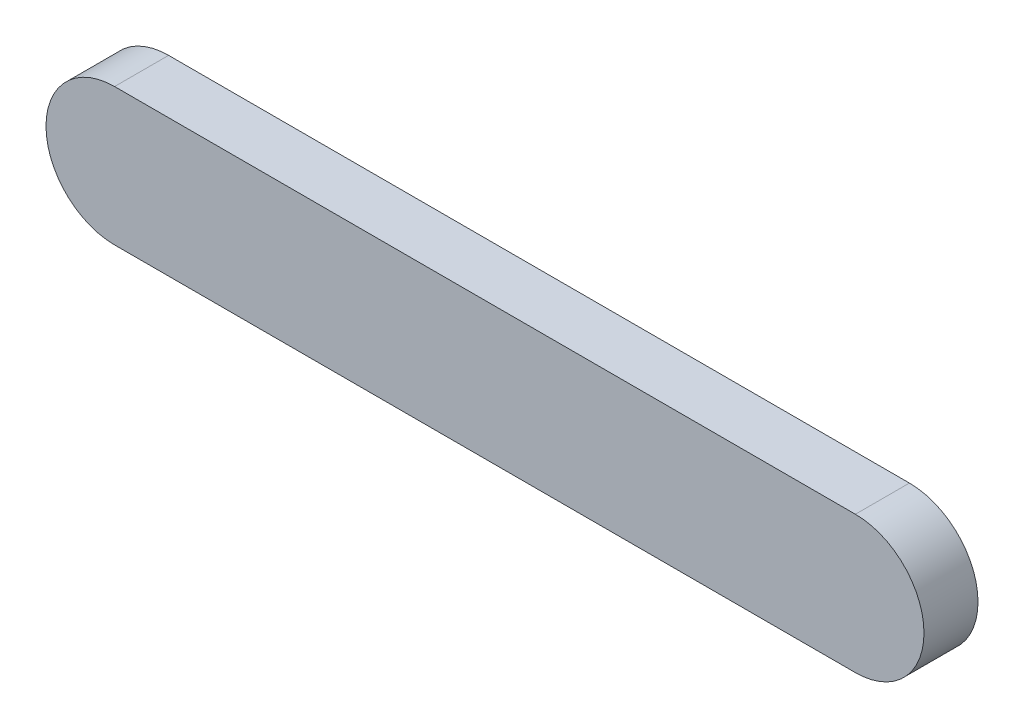
ISO-10303-21;
HEADER;
FILE_DESCRIPTION(('STEP AP214'),'2;1');
FILE_NAME('part.step','',(''),(''),'','','');
FILE_SCHEMA(('AUTOMOTIVE_DESIGN { 1 0 10303 214 1 1 1 1 }'));
ENDSEC;
DATA;
#1=APPLICATION_CONTEXT('core data for automotive mechanical design processes');
#2=APPLICATION_PROTOCOL_DEFINITION('international standard','automotive_design',2000,#1);
#3=PRODUCT_CONTEXT('',#1,'mechanical');
#4=PRODUCT('Part','Part','',(#3));
#5=PRODUCT_RELATED_PRODUCT_CATEGORY('part','',(#4));
#6=PRODUCT_DEFINITION_FORMATION('','',#4);
#7=PRODUCT_DEFINITION_CONTEXT('part definition',#1,'design');
#8=PRODUCT_DEFINITION('design','',#6,#7);
#9=PRODUCT_DEFINITION_SHAPE('','',#8);
#10=(LENGTH_UNIT() NAMED_UNIT(*) SI_UNIT(.MILLI.,.METRE.));
#11=(NAMED_UNIT(*) PLANE_ANGLE_UNIT() SI_UNIT($,.RADIAN.));
#12=(NAMED_UNIT(*) SI_UNIT($,.STERADIAN.) SOLID_ANGLE_UNIT());
#13=UNCERTAINTY_MEASURE_WITH_UNIT(LENGTH_MEASURE(1.E-05),#10,'distance_accuracy_value','');
#14=(GEOMETRIC_REPRESENTATION_CONTEXT(3) GLOBAL_UNCERTAINTY_ASSIGNED_CONTEXT((#13)) GLOBAL_UNIT_ASSIGNED_CONTEXT((#10,
#11,#12)) REPRESENTATION_CONTEXT('',''));
#15=CARTESIAN_POINT('',(0.,0.,0.));
#16=DIRECTION('',(0.,0.,1.));
#17=DIRECTION('',(1.,0.,0.));
#18=AXIS2_PLACEMENT_3D('',#15,#16,#17);
#19=CARTESIAN_POINT('',(112.776,117.9576,0.));
#20=DIRECTION('',(0.,1.,0.));
#21=DIRECTION('',(1.,0.,0.));
#22=AXIS2_PLACEMENT_3D('',#19,#20,#21);
#23=PLANE('',#22);
#24=DIRECTION('',(1.,0.,0.));
#25=VECTOR('',#24,1.);
#26=CARTESIAN_POINT('',(112.776,117.9576,0.1999996));
#27=LINE('',#26,#25);
#28=CARTESIAN_POINT('',(112.776,117.9576,0.1999996));
#29=VERTEX_POINT('',#28);
#30=CARTESIAN_POINT('',(115.5192,117.9576,0.1999996));
#31=VERTEX_POINT('',#30);
#32=EDGE_CURVE('E11',#29,#31,#27,.T.);
#33=ORIENTED_EDGE('',*,*,#32,.F.);
#34=DIRECTION('',(0.,0.,1.));
#35=VECTOR('',#34,1.);
#36=CARTESIAN_POINT('',(112.776,117.9576,0.));
#37=LINE('',#36,#35);
#38=CARTESIAN_POINT('',(112.776,117.9576,0.));
#39=VERTEX_POINT('',#38);
#40=EDGE_CURVE('E24',#39,#29,#37,.T.);
#41=ORIENTED_EDGE('',*,*,#40,.F.);
#42=DIRECTION('',(1.,0.,0.));
#43=VECTOR('',#42,1.);
#44=CARTESIAN_POINT('',(112.776,117.9576,0.));
#45=LINE('',#44,#43);
#46=CARTESIAN_POINT('',(115.5192,117.9576,0.));
#47=VERTEX_POINT('',#46);
#48=EDGE_CURVE('E75',#39,#47,#45,.T.);
#49=ORIENTED_EDGE('',*,*,#48,.T.);
#50=DIRECTION('',(0.,0.,1.));
#51=VECTOR('',#50,1.);
#52=CARTESIAN_POINT('',(115.5192,117.9576,0.));
#53=LINE('',#52,#51);
#54=EDGE_CURVE('E37',#47,#31,#53,.T.);
#55=ORIENTED_EDGE('',*,*,#54,.T.);
#56=EDGE_LOOP('',(#33,#41,#49,#55));
#57=FACE_BOUND('',#56,.T.);
#58=ADVANCED_FACE('F17',(#57),#23,.F.);
#59=CARTESIAN_POINT('',(115.5192,118.2116,0.));
#60=DIRECTION('',(0.,0.,-1.));
#61=DIRECTION('',(0.,-1.,0.));
#62=AXIS2_PLACEMENT_3D('',#59,#60,#61);
#63=CYLINDRICAL_SURFACE('',#62,0.254);
#64=CARTESIAN_POINT('',(115.5192,118.2116,0.1999996));
#65=DIRECTION('',(0.,0.,1.));
#66=DIRECTION('',(0.,-1.,0.));
#67=AXIS2_PLACEMENT_3D('',#64,#65,#66);
#68=CIRCLE('',#67,0.254);
#69=CARTESIAN_POINT('',(115.5192,118.4656,0.1999996));
#70=VERTEX_POINT('',#69);
#71=EDGE_CURVE('E83',#31,#70,#68,.T.);
#72=ORIENTED_EDGE('',*,*,#71,.F.);
#73=ORIENTED_EDGE('',*,*,#54,.F.);
#74=CARTESIAN_POINT('',(115.5192,118.2116,0.));
#75=DIRECTION('',(0.,0.,1.));
#76=DIRECTION('',(0.,-1.,0.));
#77=AXIS2_PLACEMENT_3D('',#74,#75,#76);
#78=CIRCLE('',#77,0.254);
#79=CARTESIAN_POINT('',(115.5192,118.4656,0.));
#80=VERTEX_POINT('',#79);
#81=EDGE_CURVE('E81',#47,#80,#78,.T.);
#82=ORIENTED_EDGE('',*,*,#81,.T.);
#83=DIRECTION('',(0.,0.,1.));
#84=VECTOR('',#83,1.);
#85=CARTESIAN_POINT('',(115.5192,118.4656,0.));
#86=LINE('',#85,#84);
#87=EDGE_CURVE('E67',#80,#70,#86,.T.);
#88=ORIENTED_EDGE('',*,*,#87,.T.);
#89=EDGE_LOOP('',(#72,#73,#82,#88));
#90=FACE_BOUND('',#89,.T.);
#91=ADVANCED_FACE('F89',(#90),#63,.T.);
#92=CARTESIAN_POINT('',(115.5192,118.4656,0.));
#93=DIRECTION('',(0.,-1.,0.));
#94=DIRECTION('',(-1.,0.,0.));
#95=AXIS2_PLACEMENT_3D('',#92,#93,#94);
#96=PLANE('',#95);
#97=DIRECTION('',(-1.,0.,0.));
#98=VECTOR('',#97,1.);
#99=CARTESIAN_POINT('',(115.5192,118.4656,0.1999996));
#100=LINE('',#99,#98);
#101=CARTESIAN_POINT('',(112.776,118.4656,0.1999996));
#102=VERTEX_POINT('',#101);
#103=EDGE_CURVE('E71',#70,#102,#100,.T.);
#104=ORIENTED_EDGE('',*,*,#103,.F.);
#105=ORIENTED_EDGE('',*,*,#87,.F.);
#106=DIRECTION('',(-1.,0.,0.));
#107=VECTOR('',#106,1.);
#108=CARTESIAN_POINT('',(115.5192,118.4656,0.));
#109=LINE('',#108,#107);
#110=CARTESIAN_POINT('',(112.776,118.4656,0.));
#111=VERTEX_POINT('',#110);
#112=EDGE_CURVE('E63',#80,#111,#109,.T.);
#113=ORIENTED_EDGE('',*,*,#112,.T.);
#114=DIRECTION('',(0.,0.,1.));
#115=VECTOR('',#114,1.);
#116=CARTESIAN_POINT('',(112.776,118.4656,0.));
#117=LINE('',#116,#115);
#118=EDGE_CURVE('E53',#111,#102,#117,.T.);
#119=ORIENTED_EDGE('',*,*,#118,.T.);
#120=EDGE_LOOP('',(#104,#105,#113,#119));
#121=FACE_BOUND('',#120,.T.);
#122=ADVANCED_FACE('F66',(#121),#96,.F.);
#123=CARTESIAN_POINT('',(112.776,118.2116,0.));
#124=DIRECTION('',(0.,0.,-1.));
#125=DIRECTION('',(0.,1.,0.));
#126=AXIS2_PLACEMENT_3D('',#123,#124,#125);
#127=CYLINDRICAL_SURFACE('',#126,0.254);
#128=CARTESIAN_POINT('',(112.776,118.2116,0.1999996));
#129=DIRECTION('',(0.,0.,1.));
#130=DIRECTION('',(0.,1.,0.));
#131=AXIS2_PLACEMENT_3D('',#128,#129,#130);
#132=CIRCLE('',#131,0.254);
#133=EDGE_CURVE('E59',#102,#29,#132,.T.);
#134=ORIENTED_EDGE('',*,*,#133,.F.);
#135=ORIENTED_EDGE('',*,*,#118,.F.);
#136=CARTESIAN_POINT('',(112.776,118.2116,0.));
#137=DIRECTION('',(0.,0.,1.));
#138=DIRECTION('',(0.,1.,0.));
#139=AXIS2_PLACEMENT_3D('',#136,#137,#138);
#140=CIRCLE('',#139,0.254);
#141=EDGE_CURVE('E57',#111,#39,#140,.T.);
#142=ORIENTED_EDGE('',*,*,#141,.T.);
#143=ORIENTED_EDGE('',*,*,#40,.T.);
#144=EDGE_LOOP('',(#134,#135,#142,#143));
#145=FACE_BOUND('',#144,.T.);
#146=ADVANCED_FACE('F55',(#145),#127,.T.);
#147=CARTESIAN_POINT('',(112.776,117.9576,0.));
#148=DIRECTION('',(0.,0.,-1.));
#149=DIRECTION('',(-1.,0.,0.));
#150=AXIS2_PLACEMENT_3D('',#147,#148,#149);
#151=PLANE('',#150);
#152=ORIENTED_EDGE('',*,*,#141,.F.);
#153=ORIENTED_EDGE('',*,*,#112,.F.);
#154=ORIENTED_EDGE('',*,*,#81,.F.);
#155=ORIENTED_EDGE('',*,*,#48,.F.);
#156=EDGE_LOOP('',(#152,#153,#154,#155));
#157=FACE_BOUND('',#156,.T.);
#158=ADVANCED_FACE('F74',(#157),#151,.T.);
#159=CARTESIAN_POINT('',(112.776,117.9576,0.1999996));
#160=DIRECTION('',(0.,0.,-1.));
#161=DIRECTION('',(-1.,0.,0.));
#162=AXIS2_PLACEMENT_3D('',#159,#160,#161);
#163=PLANE('',#162);
#164=ORIENTED_EDGE('',*,*,#32,.T.);
#165=ORIENTED_EDGE('',*,*,#71,.T.);
#166=ORIENTED_EDGE('',*,*,#103,.T.);
#167=ORIENTED_EDGE('',*,*,#133,.T.);
#168=EDGE_LOOP('',(#164,#165,#166,#167));
#169=FACE_BOUND('',#168,.T.);
#170=ADVANCED_FACE('F91',(#169),#163,.F.);
#171=CLOSED_SHELL('',(#58,#91,#122,#146,#158,#170));
#172=MANIFOLD_SOLID_BREP('B1',#171);
#173=ADVANCED_BREP_SHAPE_REPRESENTATION('',(#18,#172),#14);
#174=SHAPE_DEFINITION_REPRESENTATION(#9,#173);
ENDSEC;
END-ISO-10303-21;
